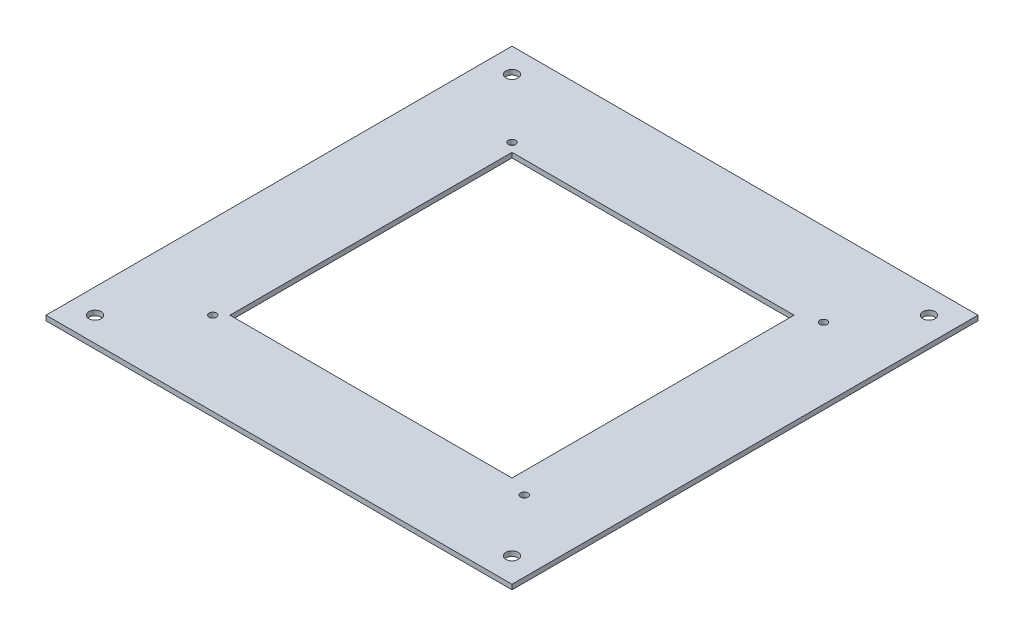
ISO-10303-21;
HEADER;
FILE_DESCRIPTION(('STEP AP214'),'2;1');
FILE_NAME('part.step','',(''),(''),'','','');
FILE_SCHEMA(('AUTOMOTIVE_DESIGN { 1 0 10303 214 1 1 1 1 }'));
ENDSEC;
DATA;
#1=APPLICATION_CONTEXT('core data for automotive mechanical design processes');
#2=APPLICATION_PROTOCOL_DEFINITION('international standard','automotive_design',2000,#1);
#3=PRODUCT_CONTEXT('',#1,'mechanical');
#4=PRODUCT('Part','Part','',(#3));
#5=PRODUCT_RELATED_PRODUCT_CATEGORY('part','',(#4));
#6=PRODUCT_DEFINITION_FORMATION('','',#4);
#7=PRODUCT_DEFINITION_CONTEXT('part definition',#1,'design');
#8=PRODUCT_DEFINITION('design','',#6,#7);
#9=PRODUCT_DEFINITION_SHAPE('','',#8);
#10=(LENGTH_UNIT() NAMED_UNIT(*) SI_UNIT(.MILLI.,.METRE.));
#11=(NAMED_UNIT(*) PLANE_ANGLE_UNIT() SI_UNIT($,.RADIAN.));
#12=(NAMED_UNIT(*) SI_UNIT($,.STERADIAN.) SOLID_ANGLE_UNIT());
#13=UNCERTAINTY_MEASURE_WITH_UNIT(LENGTH_MEASURE(1.E-05),#10,'distance_accuracy_value','');
#14=(GEOMETRIC_REPRESENTATION_CONTEXT(3) GLOBAL_UNCERTAINTY_ASSIGNED_CONTEXT((#13)) GLOBAL_UNIT_ASSIGNED_CONTEXT((#10,
#11,#12)) REPRESENTATION_CONTEXT('',''));
#15=CARTESIAN_POINT('',(0.,0.,0.));
#16=DIRECTION('',(0.,0.,1.));
#17=DIRECTION('',(1.,0.,0.));
#18=AXIS2_PLACEMENT_3D('',#15,#16,#17);
#19=CARTESIAN_POINT('',(-95.,2.,0.));
#20=DIRECTION('',(-1.,0.,0.));
#21=DIRECTION('',(0.,0.,1.));
#22=AXIS2_PLACEMENT_3D('',#19,#20,#21);
#23=PLANE('',#22);
#24=DIRECTION('',(0.,0.,-1.));
#25=VECTOR('',#24,1.);
#26=CARTESIAN_POINT('',(-95.,0.,0.));
#27=LINE('',#26,#25);
#28=CARTESIAN_POINT('',(-95.,0.,95.));
#29=VERTEX_POINT('',#28);
#30=CARTESIAN_POINT('',(-95.,0.,-95.));
#31=VERTEX_POINT('',#30);
#32=EDGE_CURVE('E150',#29,#31,#27,.T.);
#33=ORIENTED_EDGE('',*,*,#32,.F.);
#34=DIRECTION('',(0.,-1.,0.));
#35=VECTOR('',#34,1.);
#36=CARTESIAN_POINT('',(-95.,2.,95.));
#37=LINE('',#36,#35);
#38=CARTESIAN_POINT('',(-95.,2.,95.));
#39=VERTEX_POINT('',#38);
#40=EDGE_CURVE('E11',#39,#29,#37,.T.);
#41=ORIENTED_EDGE('',*,*,#40,.F.);
#42=DIRECTION('',(0.,0.,-1.));
#43=VECTOR('',#42,1.);
#44=CARTESIAN_POINT('',(-95.,2.,0.));
#45=LINE('',#44,#43);
#46=CARTESIAN_POINT('',(-95.,2.,-95.));
#47=VERTEX_POINT('',#46);
#48=EDGE_CURVE('E120',#39,#47,#45,.T.);
#49=ORIENTED_EDGE('',*,*,#48,.T.);
#50=DIRECTION('',(0.,-1.,0.));
#51=VECTOR('',#50,1.);
#52=CARTESIAN_POINT('',(-95.,2.,-95.));
#53=LINE('',#52,#51);
#54=EDGE_CURVE('E54',#47,#31,#53,.T.);
#55=ORIENTED_EDGE('',*,*,#54,.T.);
#56=EDGE_LOOP('',(#33,#41,#49,#55));
#57=FACE_BOUND('',#56,.T.);
#58=ADVANCED_FACE('F35',(#57),#23,.T.);
#59=CARTESIAN_POINT('',(0.,2.,95.));
#60=DIRECTION('',(0.,0.,-1.));
#61=DIRECTION('',(-1.,0.,0.));
#62=AXIS2_PLACEMENT_3D('',#59,#60,#61);
#63=PLANE('',#62);
#64=DIRECTION('',(1.,0.,0.));
#65=VECTOR('',#64,1.);
#66=CARTESIAN_POINT('',(0.,0.,95.));
#67=LINE('',#66,#65);
#68=CARTESIAN_POINT('',(95.,0.,95.));
#69=VERTEX_POINT('',#68);
#70=EDGE_CURVE('E125',#29,#69,#67,.T.);
#71=ORIENTED_EDGE('',*,*,#70,.T.);
#72=DIRECTION('',(0.,-1.,0.));
#73=VECTOR('',#72,1.);
#74=CARTESIAN_POINT('',(95.,2.,95.));
#75=LINE('',#74,#73);
#76=CARTESIAN_POINT('',(95.,2.,95.));
#77=VERTEX_POINT('',#76);
#78=EDGE_CURVE('E45',#77,#69,#75,.T.);
#79=ORIENTED_EDGE('',*,*,#78,.F.);
#80=DIRECTION('',(1.,0.,0.));
#81=VECTOR('',#80,1.);
#82=CARTESIAN_POINT('',(0.,2.,95.));
#83=LINE('',#82,#81);
#84=EDGE_CURVE('E115',#39,#77,#83,.T.);
#85=ORIENTED_EDGE('',*,*,#84,.F.);
#86=ORIENTED_EDGE('',*,*,#40,.T.);
#87=EDGE_LOOP('',(#71,#79,#85,#86));
#88=FACE_BOUND('',#87,.T.);
#89=ADVANCED_FACE('F123',(#88),#63,.F.);
#90=CARTESIAN_POINT('',(95.,2.,0.));
#91=DIRECTION('',(-1.,0.,0.));
#92=DIRECTION('',(0.,0.,1.));
#93=AXIS2_PLACEMENT_3D('',#90,#91,#92);
#94=PLANE('',#93);
#95=DIRECTION('',(0.,0.,-1.));
#96=VECTOR('',#95,1.);
#97=CARTESIAN_POINT('',(95.,0.,0.));
#98=LINE('',#97,#96);
#99=CARTESIAN_POINT('',(95.,0.,-95.));
#100=VERTEX_POINT('',#99);
#101=EDGE_CURVE('E147',#69,#100,#98,.T.);
#102=ORIENTED_EDGE('',*,*,#101,.T.);
#103=DIRECTION('',(0.,-1.,0.));
#104=VECTOR('',#103,1.);
#105=CARTESIAN_POINT('',(95.,2.,-95.));
#106=LINE('',#105,#104);
#107=CARTESIAN_POINT('',(95.,2.,-95.));
#108=VERTEX_POINT('',#107);
#109=EDGE_CURVE('E80',#108,#100,#106,.T.);
#110=ORIENTED_EDGE('',*,*,#109,.F.);
#111=DIRECTION('',(0.,0.,-1.));
#112=VECTOR('',#111,1.);
#113=CARTESIAN_POINT('',(95.,2.,0.));
#114=LINE('',#113,#112);
#115=EDGE_CURVE('E107',#77,#108,#114,.T.);
#116=ORIENTED_EDGE('',*,*,#115,.F.);
#117=ORIENTED_EDGE('',*,*,#78,.T.);
#118=EDGE_LOOP('',(#102,#110,#116,#117));
#119=FACE_BOUND('',#118,.T.);
#120=ADVANCED_FACE('F109',(#119),#94,.F.);
#121=CARTESIAN_POINT('',(57.5000000000001,2.,0.));
#122=DIRECTION('',(-1.,0.,0.));
#123=DIRECTION('',(0.,0.,1.));
#124=AXIS2_PLACEMENT_3D('',#121,#122,#123);
#125=PLANE('',#124);
#126=DIRECTION('',(0.,0.,-1.));
#127=VECTOR('',#126,1.);
#128=CARTESIAN_POINT('',(57.5000000000001,0.,0.));
#129=LINE('',#128,#127);
#130=CARTESIAN_POINT('',(57.5000000000001,0.,57.5000000000001));
#131=VERTEX_POINT('',#130);
#132=CARTESIAN_POINT('',(57.5000000000001,0.,-57.4999999999998));
#133=VERTEX_POINT('',#132);
#134=EDGE_CURVE('E160',#131,#133,#129,.T.);
#135=ORIENTED_EDGE('',*,*,#134,.F.);
#136=DIRECTION('',(0.,-1.,0.));
#137=VECTOR('',#136,1.);
#138=CARTESIAN_POINT('',(57.5000000000001,2.,57.5000000000001));
#139=LINE('',#138,#137);
#140=CARTESIAN_POINT('',(57.5000000000001,2.,57.5000000000001));
#141=VERTEX_POINT('',#140);
#142=EDGE_CURVE('E39',#141,#131,#139,.T.);
#143=ORIENTED_EDGE('',*,*,#142,.F.);
#144=DIRECTION('',(0.,0.,-1.));
#145=VECTOR('',#144,1.);
#146=CARTESIAN_POINT('',(57.5000000000001,2.,0.));
#147=LINE('',#146,#145);
#148=CARTESIAN_POINT('',(57.5000000000001,2.,-57.4999999999998));
#149=VERTEX_POINT('',#148);
#150=EDGE_CURVE('E196',#141,#149,#147,.T.);
#151=ORIENTED_EDGE('',*,*,#150,.T.);
#152=DIRECTION('',(0.,-1.,0.));
#153=VECTOR('',#152,1.);
#154=CARTESIAN_POINT('',(57.5000000000001,2.,-57.4999999999998));
#155=LINE('',#154,#153);
#156=EDGE_CURVE('E130',#149,#133,#155,.T.);
#157=ORIENTED_EDGE('',*,*,#156,.T.);
#158=EDGE_LOOP('',(#135,#143,#151,#157));
#159=FACE_BOUND('',#158,.T.);
#160=ADVANCED_FACE('F250',(#159),#125,.T.);
#161=CARTESIAN_POINT('',(0.,2.,57.5000000000001));
#162=DIRECTION('',(0.,0.,-1.));
#163=DIRECTION('',(-1.,0.,0.));
#164=AXIS2_PLACEMENT_3D('',#161,#162,#163);
#165=PLANE('',#164);
#166=DIRECTION('',(1.,0.,0.));
#167=VECTOR('',#166,1.);
#168=CARTESIAN_POINT('',(0.,0.,57.5000000000001));
#169=LINE('',#168,#167);
#170=CARTESIAN_POINT('',(-57.4999999999999,0.,57.5000000000001));
#171=VERTEX_POINT('',#170);
#172=EDGE_CURVE('E157',#171,#131,#169,.T.);
#173=ORIENTED_EDGE('',*,*,#172,.F.);
#174=DIRECTION('',(0.,-1.,0.));
#175=VECTOR('',#174,1.);
#176=CARTESIAN_POINT('',(-57.4999999999999,2.,57.5000000000001));
#177=LINE('',#176,#175);
#178=CARTESIAN_POINT('',(-57.4999999999999,2.,57.5000000000001));
#179=VERTEX_POINT('',#178);
#180=EDGE_CURVE('E134',#179,#171,#177,.T.);
#181=ORIENTED_EDGE('',*,*,#180,.F.);
#182=DIRECTION('',(1.,0.,0.));
#183=VECTOR('',#182,1.);
#184=CARTESIAN_POINT('',(0.,2.,57.5000000000001));
#185=LINE('',#184,#183);
#186=EDGE_CURVE('E194',#179,#141,#185,.T.);
#187=ORIENTED_EDGE('',*,*,#186,.T.);
#188=ORIENTED_EDGE('',*,*,#142,.T.);
#189=EDGE_LOOP('',(#173,#181,#187,#188));
#190=FACE_BOUND('',#189,.T.);
#191=ADVANCED_FACE('F245',(#190),#165,.T.);
#192=CARTESIAN_POINT('',(-57.4999999999999,2.,0.));
#193=DIRECTION('',(-1.,0.,0.));
#194=DIRECTION('',(0.,0.,1.));
#195=AXIS2_PLACEMENT_3D('',#192,#193,#194);
#196=PLANE('',#195);
#197=DIRECTION('',(0.,0.,-1.));
#198=VECTOR('',#197,1.);
#199=CARTESIAN_POINT('',(-57.4999999999999,0.,0.));
#200=LINE('',#199,#198);
#201=CARTESIAN_POINT('',(-57.4999999999999,0.,-57.4999999999998));
#202=VERTEX_POINT('',#201);
#203=EDGE_CURVE('E155',#171,#202,#200,.T.);
#204=ORIENTED_EDGE('',*,*,#203,.T.);
#205=DIRECTION('',(0.,-1.,0.));
#206=VECTOR('',#205,1.);
#207=CARTESIAN_POINT('',(-57.4999999999999,2.,-57.4999999999998));
#208=LINE('',#207,#206);
#209=CARTESIAN_POINT('',(-57.4999999999999,2.,-57.4999999999998));
#210=VERTEX_POINT('',#209);
#211=EDGE_CURVE('E132',#210,#202,#208,.T.);
#212=ORIENTED_EDGE('',*,*,#211,.F.);
#213=DIRECTION('',(0.,0.,-1.));
#214=VECTOR('',#213,1.);
#215=CARTESIAN_POINT('',(-57.4999999999999,2.,0.));
#216=LINE('',#215,#214);
#217=EDGE_CURVE('E191',#179,#210,#216,.T.);
#218=ORIENTED_EDGE('',*,*,#217,.F.);
#219=ORIENTED_EDGE('',*,*,#180,.T.);
#220=EDGE_LOOP('',(#204,#212,#218,#219));
#221=FACE_BOUND('',#220,.T.);
#222=ADVANCED_FACE('F247',(#221),#196,.F.);
#223=CARTESIAN_POINT('',(0.,2.,-57.4999999999998));
#224=DIRECTION('',(0.,0.,-1.));
#225=DIRECTION('',(-1.,0.,0.));
#226=AXIS2_PLACEMENT_3D('',#223,#224,#225);
#227=PLANE('',#226);
#228=DIRECTION('',(1.,0.,0.));
#229=VECTOR('',#228,1.);
#230=CARTESIAN_POINT('',(0.,0.,-57.4999999999998));
#231=LINE('',#230,#229);
#232=EDGE_CURVE('E152',#202,#133,#231,.T.);
#233=ORIENTED_EDGE('',*,*,#232,.T.);
#234=ORIENTED_EDGE('',*,*,#156,.F.);
#235=DIRECTION('',(1.,0.,0.));
#236=VECTOR('',#235,1.);
#237=CARTESIAN_POINT('',(0.,2.,-57.4999999999998));
#238=LINE('',#237,#236);
#239=EDGE_CURVE('E189',#210,#149,#238,.T.);
#240=ORIENTED_EDGE('',*,*,#239,.F.);
#241=ORIENTED_EDGE('',*,*,#211,.T.);
#242=EDGE_LOOP('',(#233,#234,#240,#241));
#243=FACE_BOUND('',#242,.T.);
#244=ADVANCED_FACE('F249',(#243),#227,.F.);
#245=CARTESIAN_POINT('',(-85.,2.,-85.));
#246=DIRECTION('',(0.,-1.,0.));
#247=DIRECTION('',(0.,0.,-1.));
#248=AXIS2_PLACEMENT_3D('',#245,#246,#247);
#249=CYLINDRICAL_SURFACE('',#248,2.5);
#250=CARTESIAN_POINT('',(-85.,2.,-85.));
#251=DIRECTION('',(0.,1.,0.));
#252=DIRECTION('',(0.,0.,1.));
#253=AXIS2_PLACEMENT_3D('',#250,#251,#252);
#254=CIRCLE('',#253,2.5);
#255=CARTESIAN_POINT('',(-85.,2.,-82.5));
#256=VERTEX_POINT('',#255);
#257=EDGE_CURVE('E198',#256,#256,#254,.T.);
#258=ORIENTED_EDGE('',*,*,#257,.T.);
#259=EDGE_LOOP('',(#258));
#260=FACE_BOUND('',#259,.T.);
#261=CARTESIAN_POINT('',(-85.,0.,-85.));
#262=DIRECTION('',(0.,1.,0.));
#263=DIRECTION('',(0.,0.,1.));
#264=AXIS2_PLACEMENT_3D('',#261,#262,#263);
#265=CIRCLE('',#264,2.5);
#266=CARTESIAN_POINT('',(-85.,0.,-82.5));
#267=VERTEX_POINT('',#266);
#268=EDGE_CURVE('E163',#267,#267,#265,.T.);
#269=ORIENTED_EDGE('',*,*,#268,.F.);
#270=EDGE_LOOP('',(#269));
#271=FACE_BOUND('',#270,.T.);
#272=ADVANCED_FACE('F272',(#260,#271),#249,.F.);
#273=CARTESIAN_POINT('',(85.,2.,-85.));
#274=DIRECTION('',(0.,-1.,0.));
#275=DIRECTION('',(0.,0.,-1.));
#276=AXIS2_PLACEMENT_3D('',#273,#274,#275);
#277=CYLINDRICAL_SURFACE('',#276,2.5);
#278=CARTESIAN_POINT('',(85.,2.,-85.));
#279=DIRECTION('',(0.,1.,0.));
#280=DIRECTION('',(0.,0.,1.));
#281=AXIS2_PLACEMENT_3D('',#278,#279,#280);
#282=CIRCLE('',#281,2.5);
#283=CARTESIAN_POINT('',(85.,2.,-82.5));
#284=VERTEX_POINT('',#283);
#285=EDGE_CURVE('E201',#284,#284,#282,.T.);
#286=ORIENTED_EDGE('',*,*,#285,.T.);
#287=EDGE_LOOP('',(#286));
#288=FACE_BOUND('',#287,.T.);
#289=CARTESIAN_POINT('',(85.,0.,-85.));
#290=DIRECTION('',(0.,1.,0.));
#291=DIRECTION('',(0.,0.,1.));
#292=AXIS2_PLACEMENT_3D('',#289,#290,#291);
#293=CIRCLE('',#292,2.5);
#294=CARTESIAN_POINT('',(85.,0.,-82.5));
#295=VERTEX_POINT('',#294);
#296=EDGE_CURVE('E166',#295,#295,#293,.T.);
#297=ORIENTED_EDGE('',*,*,#296,.F.);
#298=EDGE_LOOP('',(#297));
#299=FACE_BOUND('',#298,.T.);
#300=ADVANCED_FACE('F281',(#288,#299),#277,.F.);
#301=CARTESIAN_POINT('',(85.,2.,85.));
#302=DIRECTION('',(0.,-1.,0.));
#303=DIRECTION('',(0.,0.,-1.));
#304=AXIS2_PLACEMENT_3D('',#301,#302,#303);
#305=CYLINDRICAL_SURFACE('',#304,2.5);
#306=CARTESIAN_POINT('',(85.,2.,85.));
#307=DIRECTION('',(0.,1.,0.));
#308=DIRECTION('',(0.,0.,1.));
#309=AXIS2_PLACEMENT_3D('',#306,#307,#308);
#310=CIRCLE('',#309,2.5);
#311=CARTESIAN_POINT('',(85.,2.,87.5));
#312=VERTEX_POINT('',#311);
#313=EDGE_CURVE('E204',#312,#312,#310,.T.);
#314=ORIENTED_EDGE('',*,*,#313,.T.);
#315=EDGE_LOOP('',(#314));
#316=FACE_BOUND('',#315,.T.);
#317=CARTESIAN_POINT('',(85.,0.,85.));
#318=DIRECTION('',(0.,1.,0.));
#319=DIRECTION('',(0.,0.,1.));
#320=AXIS2_PLACEMENT_3D('',#317,#318,#319);
#321=CIRCLE('',#320,2.5);
#322=CARTESIAN_POINT('',(85.,0.,87.5));
#323=VERTEX_POINT('',#322);
#324=EDGE_CURVE('E169',#323,#323,#321,.T.);
#325=ORIENTED_EDGE('',*,*,#324,.F.);
#326=EDGE_LOOP('',(#325));
#327=FACE_BOUND('',#326,.T.);
#328=ADVANCED_FACE('F285',(#316,#327),#305,.F.);
#329=CARTESIAN_POINT('',(-85.,2.,85.));
#330=DIRECTION('',(0.,-1.,0.));
#331=DIRECTION('',(0.,0.,-1.));
#332=AXIS2_PLACEMENT_3D('',#329,#330,#331);
#333=CYLINDRICAL_SURFACE('',#332,2.5);
#334=CARTESIAN_POINT('',(-85.,2.,85.));
#335=DIRECTION('',(0.,1.,0.));
#336=DIRECTION('',(0.,0.,1.));
#337=AXIS2_PLACEMENT_3D('',#334,#335,#336);
#338=CIRCLE('',#337,2.5);
#339=CARTESIAN_POINT('',(-85.,2.,87.5));
#340=VERTEX_POINT('',#339);
#341=EDGE_CURVE('E207',#340,#340,#338,.T.);
#342=ORIENTED_EDGE('',*,*,#341,.T.);
#343=EDGE_LOOP('',(#342));
#344=FACE_BOUND('',#343,.T.);
#345=CARTESIAN_POINT('',(-85.,0.,85.));
#346=DIRECTION('',(0.,1.,0.));
#347=DIRECTION('',(0.,0.,1.));
#348=AXIS2_PLACEMENT_3D('',#345,#346,#347);
#349=CIRCLE('',#348,2.5);
#350=CARTESIAN_POINT('',(-85.,0.,87.5));
#351=VERTEX_POINT('',#350);
#352=EDGE_CURVE('E172',#351,#351,#349,.T.);
#353=ORIENTED_EDGE('',*,*,#352,.F.);
#354=EDGE_LOOP('',(#353));
#355=FACE_BOUND('',#354,.T.);
#356=ADVANCED_FACE('F289',(#344,#355),#333,.F.);
#357=CARTESIAN_POINT('',(-61.,2.,-61.));
#358=DIRECTION('',(0.,-1.,0.));
#359=DIRECTION('',(0.,0.,-1.));
#360=AXIS2_PLACEMENT_3D('',#357,#358,#359);
#361=CYLINDRICAL_SURFACE('',#360,1.5);
#362=CARTESIAN_POINT('',(-61.,2.,-61.));
#363=DIRECTION('',(0.,1.,0.));
#364=DIRECTION('',(0.,0.,1.));
#365=AXIS2_PLACEMENT_3D('',#362,#363,#364);
#366=CIRCLE('',#365,1.5);
#367=CARTESIAN_POINT('',(-61.,2.,-59.5));
#368=VERTEX_POINT('',#367);
#369=EDGE_CURVE('E210',#368,#368,#366,.T.);
#370=ORIENTED_EDGE('',*,*,#369,.T.);
#371=EDGE_LOOP('',(#370));
#372=FACE_BOUND('',#371,.T.);
#373=CARTESIAN_POINT('',(-61.,0.,-61.));
#374=DIRECTION('',(0.,1.,0.));
#375=DIRECTION('',(0.,0.,1.));
#376=AXIS2_PLACEMENT_3D('',#373,#374,#375);
#377=CIRCLE('',#376,1.5);
#378=CARTESIAN_POINT('',(-61.,0.,-59.5));
#379=VERTEX_POINT('',#378);
#380=EDGE_CURVE('E175',#379,#379,#377,.T.);
#381=ORIENTED_EDGE('',*,*,#380,.F.);
#382=EDGE_LOOP('',(#381));
#383=FACE_BOUND('',#382,.T.);
#384=ADVANCED_FACE('F293',(#372,#383),#361,.F.);
#385=CARTESIAN_POINT('',(66.,2.,-61.));
#386=DIRECTION('',(0.,-1.,0.));
#387=DIRECTION('',(0.,0.,-1.));
#388=AXIS2_PLACEMENT_3D('',#385,#386,#387);
#389=CYLINDRICAL_SURFACE('',#388,1.5);
#390=CARTESIAN_POINT('',(66.,2.,-61.));
#391=DIRECTION('',(0.,1.,0.));
#392=DIRECTION('',(0.,0.,1.));
#393=AXIS2_PLACEMENT_3D('',#390,#391,#392);
#394=CIRCLE('',#393,1.5);
#395=CARTESIAN_POINT('',(66.,2.,-59.5));
#396=VERTEX_POINT('',#395);
#397=EDGE_CURVE('E213',#396,#396,#394,.T.);
#398=ORIENTED_EDGE('',*,*,#397,.T.);
#399=EDGE_LOOP('',(#398));
#400=FACE_BOUND('',#399,.T.);
#401=CARTESIAN_POINT('',(66.,0.,-61.));
#402=DIRECTION('',(0.,1.,0.));
#403=DIRECTION('',(0.,0.,1.));
#404=AXIS2_PLACEMENT_3D('',#401,#402,#403);
#405=CIRCLE('',#404,1.5);
#406=CARTESIAN_POINT('',(66.,0.,-59.5));
#407=VERTEX_POINT('',#406);
#408=EDGE_CURVE('E178',#407,#407,#405,.T.);
#409=ORIENTED_EDGE('',*,*,#408,.F.);
#410=EDGE_LOOP('',(#409));
#411=FACE_BOUND('',#410,.T.);
#412=ADVANCED_FACE('F297',(#400,#411),#389,.F.);
#413=CARTESIAN_POINT('',(66.,2.,61.));
#414=DIRECTION('',(0.,-1.,0.));
#415=DIRECTION('',(0.,0.,-1.));
#416=AXIS2_PLACEMENT_3D('',#413,#414,#415);
#417=CYLINDRICAL_SURFACE('',#416,1.5);
#418=CARTESIAN_POINT('',(66.,2.,61.));
#419=DIRECTION('',(0.,1.,0.));
#420=DIRECTION('',(0.,0.,1.));
#421=AXIS2_PLACEMENT_3D('',#418,#419,#420);
#422=CIRCLE('',#421,1.5);
#423=CARTESIAN_POINT('',(66.,2.,62.5));
#424=VERTEX_POINT('',#423);
#425=EDGE_CURVE('E216',#424,#424,#422,.T.);
#426=ORIENTED_EDGE('',*,*,#425,.T.);
#427=EDGE_LOOP('',(#426));
#428=FACE_BOUND('',#427,.T.);
#429=CARTESIAN_POINT('',(66.,0.,61.));
#430=DIRECTION('',(0.,1.,0.));
#431=DIRECTION('',(0.,0.,1.));
#432=AXIS2_PLACEMENT_3D('',#429,#430,#431);
#433=CIRCLE('',#432,1.5);
#434=CARTESIAN_POINT('',(66.,0.,62.5));
#435=VERTEX_POINT('',#434);
#436=EDGE_CURVE('E181',#435,#435,#433,.T.);
#437=ORIENTED_EDGE('',*,*,#436,.F.);
#438=EDGE_LOOP('',(#437));
#439=FACE_BOUND('',#438,.T.);
#440=ADVANCED_FACE('F261',(#428,#439),#417,.F.);
#441=CARTESIAN_POINT('',(-61.,2.,61.0000000000001));
#442=DIRECTION('',(0.,-1.,0.));
#443=DIRECTION('',(0.,0.,-1.));
#444=AXIS2_PLACEMENT_3D('',#441,#442,#443);
#445=CYLINDRICAL_SURFACE('',#444,1.5);
#446=CARTESIAN_POINT('',(-61.,2.,61.0000000000001));
#447=DIRECTION('',(0.,1.,0.));
#448=DIRECTION('',(0.,0.,1.));
#449=AXIS2_PLACEMENT_3D('',#446,#447,#448);
#450=CIRCLE('',#449,1.5);
#451=CARTESIAN_POINT('',(-61.,2.,62.5000000000001));
#452=VERTEX_POINT('',#451);
#453=EDGE_CURVE('E146',#452,#452,#450,.T.);
#454=ORIENTED_EDGE('',*,*,#453,.T.);
#455=EDGE_LOOP('',(#454));
#456=FACE_BOUND('',#455,.T.);
#457=CARTESIAN_POINT('',(-61.,0.,61.0000000000001));
#458=DIRECTION('',(0.,1.,0.));
#459=DIRECTION('',(0.,0.,1.));
#460=AXIS2_PLACEMENT_3D('',#457,#458,#459);
#461=CIRCLE('',#460,1.5);
#462=CARTESIAN_POINT('',(-61.,0.,62.5000000000001));
#463=VERTEX_POINT('',#462);
#464=EDGE_CURVE('E184',#463,#463,#461,.T.);
#465=ORIENTED_EDGE('',*,*,#464,.F.);
#466=EDGE_LOOP('',(#465));
#467=FACE_BOUND('',#466,.T.);
#468=ADVANCED_FACE('F37',(#456,#467),#445,.F.);
#469=CARTESIAN_POINT('',(0.,2.,-95.));
#470=DIRECTION('',(0.,0.,-1.));
#471=DIRECTION('',(-1.,0.,0.));
#472=AXIS2_PLACEMENT_3D('',#469,#470,#471);
#473=PLANE('',#472);
#474=DIRECTION('',(1.,0.,0.));
#475=VECTOR('',#474,1.);
#476=CARTESIAN_POINT('',(0.,0.,-95.));
#477=LINE('',#476,#475);
#478=EDGE_CURVE('E143',#31,#100,#477,.T.);
#479=ORIENTED_EDGE('',*,*,#478,.F.);
#480=ORIENTED_EDGE('',*,*,#54,.F.);
#481=DIRECTION('',(1.,0.,0.));
#482=VECTOR('',#481,1.);
#483=CARTESIAN_POINT('',(0.,2.,-95.));
#484=LINE('',#483,#482);
#485=EDGE_CURVE('E114',#47,#108,#484,.T.);
#486=ORIENTED_EDGE('',*,*,#485,.T.);
#487=ORIENTED_EDGE('',*,*,#109,.T.);
#488=EDGE_LOOP('',(#479,#480,#486,#487));
#489=FACE_BOUND('',#488,.T.);
#490=ADVANCED_FACE('F227',(#489),#473,.T.);
#491=CARTESIAN_POINT('',(0.,2.,0.));
#492=DIRECTION('',(0.,1.,0.));
#493=DIRECTION('',(0.,0.,1.));
#494=AXIS2_PLACEMENT_3D('',#491,#492,#493);
#495=PLANE('',#494);
#496=ORIENTED_EDGE('',*,*,#453,.F.);
#497=EDGE_LOOP('',(#496));
#498=FACE_BOUND('',#497,.T.);
#499=ORIENTED_EDGE('',*,*,#425,.F.);
#500=EDGE_LOOP('',(#499));
#501=FACE_BOUND('',#500,.T.);
#502=ORIENTED_EDGE('',*,*,#397,.F.);
#503=EDGE_LOOP('',(#502));
#504=FACE_BOUND('',#503,.T.);
#505=ORIENTED_EDGE('',*,*,#369,.F.);
#506=EDGE_LOOP('',(#505));
#507=FACE_BOUND('',#506,.T.);
#508=ORIENTED_EDGE('',*,*,#341,.F.);
#509=EDGE_LOOP('',(#508));
#510=FACE_BOUND('',#509,.T.);
#511=ORIENTED_EDGE('',*,*,#313,.F.);
#512=EDGE_LOOP('',(#511));
#513=FACE_BOUND('',#512,.T.);
#514=ORIENTED_EDGE('',*,*,#285,.F.);
#515=EDGE_LOOP('',(#514));
#516=FACE_BOUND('',#515,.T.);
#517=ORIENTED_EDGE('',*,*,#257,.F.);
#518=EDGE_LOOP('',(#517));
#519=FACE_BOUND('',#518,.T.);
#520=ORIENTED_EDGE('',*,*,#150,.F.);
#521=ORIENTED_EDGE('',*,*,#186,.F.);
#522=ORIENTED_EDGE('',*,*,#217,.T.);
#523=ORIENTED_EDGE('',*,*,#239,.T.);
#524=EDGE_LOOP('',(#520,#521,#522,#523));
#525=FACE_BOUND('',#524,.T.);
#526=ORIENTED_EDGE('',*,*,#48,.F.);
#527=ORIENTED_EDGE('',*,*,#84,.T.);
#528=ORIENTED_EDGE('',*,*,#115,.T.);
#529=ORIENTED_EDGE('',*,*,#485,.F.);
#530=EDGE_LOOP('',(#526,#527,#528,#529));
#531=FACE_BOUND('',#530,.T.);
#532=ADVANCED_FACE('F119',(#498,#501,#504,#507,#510,#513,#516,#519,#525,#531),#495,.T.);
#533=CARTESIAN_POINT('',(0.,0.,0.));
#534=DIRECTION('',(0.,1.,0.));
#535=DIRECTION('',(0.,0.,1.));
#536=AXIS2_PLACEMENT_3D('',#533,#534,#535);
#537=PLANE('',#536);
#538=ORIENTED_EDGE('',*,*,#464,.T.);
#539=EDGE_LOOP('',(#538));
#540=FACE_BOUND('',#539,.T.);
#541=ORIENTED_EDGE('',*,*,#436,.T.);
#542=EDGE_LOOP('',(#541));
#543=FACE_BOUND('',#542,.T.);
#544=ORIENTED_EDGE('',*,*,#408,.T.);
#545=EDGE_LOOP('',(#544));
#546=FACE_BOUND('',#545,.T.);
#547=ORIENTED_EDGE('',*,*,#380,.T.);
#548=EDGE_LOOP('',(#547));
#549=FACE_BOUND('',#548,.T.);
#550=ORIENTED_EDGE('',*,*,#352,.T.);
#551=EDGE_LOOP('',(#550));
#552=FACE_BOUND('',#551,.T.);
#553=ORIENTED_EDGE('',*,*,#324,.T.);
#554=EDGE_LOOP('',(#553));
#555=FACE_BOUND('',#554,.T.);
#556=ORIENTED_EDGE('',*,*,#296,.T.);
#557=EDGE_LOOP('',(#556));
#558=FACE_BOUND('',#557,.T.);
#559=ORIENTED_EDGE('',*,*,#268,.T.);
#560=EDGE_LOOP('',(#559));
#561=FACE_BOUND('',#560,.T.);
#562=ORIENTED_EDGE('',*,*,#134,.T.);
#563=ORIENTED_EDGE('',*,*,#232,.F.);
#564=ORIENTED_EDGE('',*,*,#203,.F.);
#565=ORIENTED_EDGE('',*,*,#172,.T.);
#566=EDGE_LOOP('',(#562,#563,#564,#565));
#567=FACE_BOUND('',#566,.T.);
#568=ORIENTED_EDGE('',*,*,#32,.T.);
#569=ORIENTED_EDGE('',*,*,#478,.T.);
#570=ORIENTED_EDGE('',*,*,#101,.F.);
#571=ORIENTED_EDGE('',*,*,#70,.F.);
#572=EDGE_LOOP('',(#568,#569,#570,#571));
#573=FACE_BOUND('',#572,.T.);
#574=ADVANCED_FACE('F226',(#540,#543,#546,#549,#552,#555,#558,#561,#567,#573),#537,.F.);
#575=CLOSED_SHELL('',(#58,#89,#120,#160,#191,#222,#244,#272,#300,#328,#356,#384,#412,#440,#468,
#490,#532,#574));
#576=MANIFOLD_SOLID_BREP('B2',#575);
#577=ADVANCED_BREP_SHAPE_REPRESENTATION('',(#18,#576),#14);
#578=SHAPE_DEFINITION_REPRESENTATION(#9,#577);
ENDSEC;
END-ISO-10303-21;
